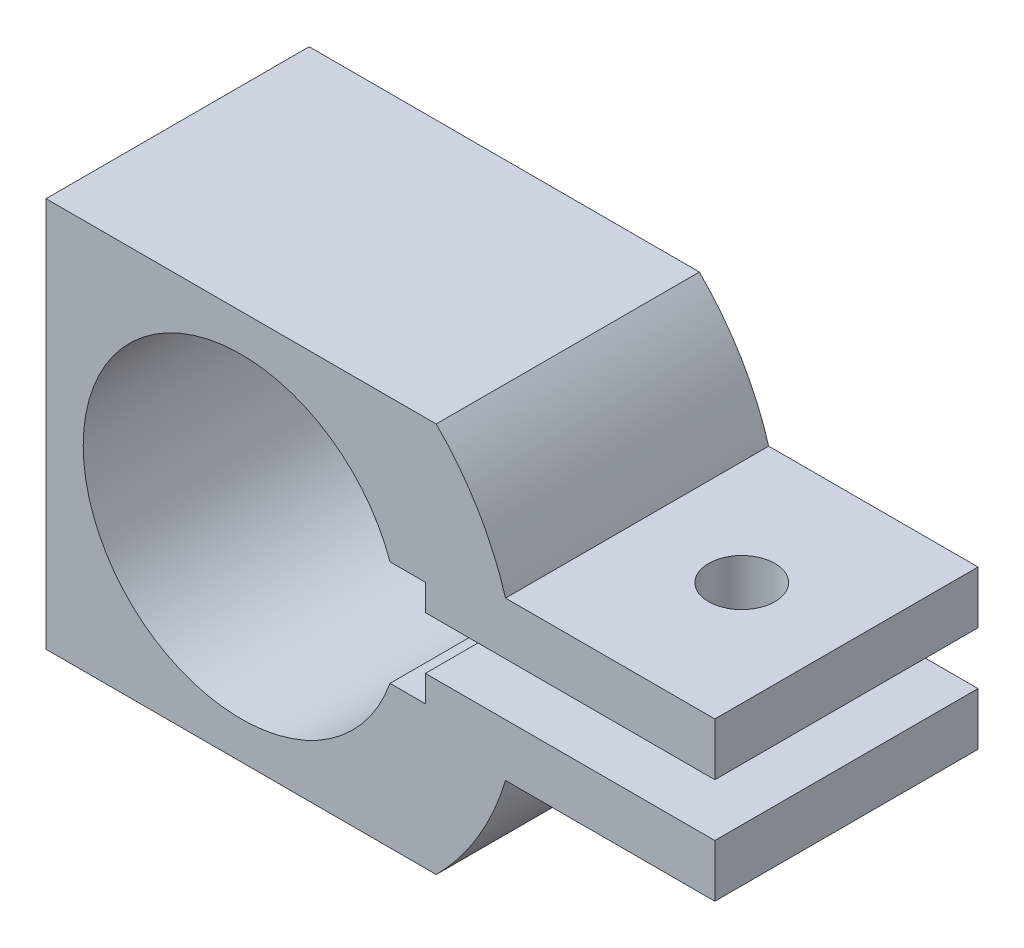
ISO-10303-21;
HEADER;
FILE_DESCRIPTION(('STEP AP214'),'2;1');
FILE_NAME('part.step','',(''),(''),'','','');
FILE_SCHEMA(('AUTOMOTIVE_DESIGN { 1 0 10303 214 1 1 1 1 }'));
ENDSEC;
DATA;
#1=APPLICATION_CONTEXT('core data for automotive mechanical design processes');
#2=APPLICATION_PROTOCOL_DEFINITION('international standard','automotive_design',2000,#1);
#3=PRODUCT_CONTEXT('',#1,'mechanical');
#4=PRODUCT('Part','Part','',(#3));
#5=PRODUCT_RELATED_PRODUCT_CATEGORY('part','',(#4));
#6=PRODUCT_DEFINITION_FORMATION('','',#4);
#7=PRODUCT_DEFINITION_CONTEXT('part definition',#1,'design');
#8=PRODUCT_DEFINITION('design','',#6,#7);
#9=PRODUCT_DEFINITION_SHAPE('','',#8);
#10=(LENGTH_UNIT() NAMED_UNIT(*) SI_UNIT(.MILLI.,.METRE.));
#11=(NAMED_UNIT(*) PLANE_ANGLE_UNIT() SI_UNIT($,.RADIAN.));
#12=(NAMED_UNIT(*) SI_UNIT($,.STERADIAN.) SOLID_ANGLE_UNIT());
#13=UNCERTAINTY_MEASURE_WITH_UNIT(LENGTH_MEASURE(1.E-05),#10,'distance_accuracy_value','');
#14=(GEOMETRIC_REPRESENTATION_CONTEXT(3) GLOBAL_UNCERTAINTY_ASSIGNED_CONTEXT((#13)) GLOBAL_UNIT_ASSIGNED_CONTEXT((#10,
#11,#12)) REPRESENTATION_CONTEXT('',''));
#15=CARTESIAN_POINT('',(0.,0.,0.));
#16=DIRECTION('',(0.,0.,1.));
#17=DIRECTION('',(1.,0.,0.));
#18=AXIS2_PLACEMENT_3D('',#15,#16,#17);
#19=CARTESIAN_POINT('',(7.,0.,97.0000000000001));
#20=DIRECTION('',(1.,0.,0.));
#21=DIRECTION('',(0.,0.,-1.));
#22=AXIS2_PLACEMENT_3D('',#19,#20,#21);
#23=PLANE('',#22);
#24=DIRECTION('',(0.,0.,-1.));
#25=VECTOR('',#24,1.);
#26=CARTESIAN_POINT('',(7.,1.,95.0000000000001));
#27=LINE('',#26,#25);
#28=CARTESIAN_POINT('',(7.,1.,10.));
#29=VERTEX_POINT('',#28);
#30=CARTESIAN_POINT('',(7.,1.,0.));
#31=VERTEX_POINT('',#30);
#32=EDGE_CURVE('E166',#29,#31,#27,.T.);
#33=ORIENTED_EDGE('',*,*,#32,.F.);
#34=DIRECTION('',(0.,1.,0.));
#35=VECTOR('',#34,1.);
#36=CARTESIAN_POINT('',(7.,0.,10.));
#37=LINE('',#36,#35);
#38=CARTESIAN_POINT('',(7.,2.,10.));
#39=VERTEX_POINT('',#38);
#40=EDGE_CURVE('E202',#29,#39,#37,.T.);
#41=ORIENTED_EDGE('',*,*,#40,.T.);
#42=DIRECTION('',(0.,0.,-1.));
#43=VECTOR('',#42,1.);
#44=CARTESIAN_POINT('',(7.,2.,97.0000000000001));
#45=LINE('',#44,#43);
#46=CARTESIAN_POINT('',(7.,2.,0.));
#47=VERTEX_POINT('',#46);
#48=EDGE_CURVE('E176',#39,#47,#45,.T.);
#49=ORIENTED_EDGE('',*,*,#48,.T.);
#50=DIRECTION('',(0.,-1.,0.));
#51=VECTOR('',#50,1.);
#52=CARTESIAN_POINT('',(7.,0.,0.));
#53=LINE('',#52,#51);
#54=EDGE_CURVE('E157',#47,#31,#53,.T.);
#55=ORIENTED_EDGE('',*,*,#54,.T.);
#56=EDGE_LOOP('',(#33,#41,#49,#55));
#57=FACE_BOUND('',#56,.T.);
#58=ADVANCED_FACE('F39',(#57),#23,.F.);
#59=CARTESIAN_POINT('',(18.,0.,285.));
#60=DIRECTION('',(1.,0.,0.));
#61=DIRECTION('',(0.,0.,-1.));
#62=AXIS2_PLACEMENT_3D('',#59,#60,#61);
#63=PLANE('',#62);
#64=DIRECTION('',(0.,1.,0.));
#65=VECTOR('',#64,1.);
#66=CARTESIAN_POINT('',(18.,0.,10.));
#67=LINE('',#66,#65);
#68=CARTESIAN_POINT('',(18.,1.,10.0000000000001));
#69=VERTEX_POINT('',#68);
#70=CARTESIAN_POINT('',(18.,3.,10.0000000000001));
#71=VERTEX_POINT('',#70);
#72=EDGE_CURVE('E261',#69,#71,#67,.T.);
#73=ORIENTED_EDGE('',*,*,#72,.F.);
#74=DIRECTION('',(0.,0.,-1.));
#75=VECTOR('',#74,1.);
#76=CARTESIAN_POINT('',(18.,1.,285.));
#77=LINE('',#76,#75);
#78=CARTESIAN_POINT('',(18.,1.,0.));
#79=VERTEX_POINT('',#78);
#80=EDGE_CURVE('E49',#69,#79,#77,.T.);
#81=ORIENTED_EDGE('',*,*,#80,.T.);
#82=DIRECTION('',(0.,-1.,0.));
#83=VECTOR('',#82,1.);
#84=CARTESIAN_POINT('',(18.,0.,0.));
#85=LINE('',#84,#83);
#86=CARTESIAN_POINT('',(18.,3.,0.));
#87=VERTEX_POINT('',#86);
#88=EDGE_CURVE('E160',#87,#79,#85,.T.);
#89=ORIENTED_EDGE('',*,*,#88,.F.);
#90=DIRECTION('',(0.,0.,-1.));
#91=VECTOR('',#90,1.);
#92=CARTESIAN_POINT('',(18.,3.,285.));
#93=LINE('',#92,#91);
#94=EDGE_CURVE('E297',#71,#87,#93,.T.);
#95=ORIENTED_EDGE('',*,*,#94,.F.);
#96=EDGE_LOOP('',(#73,#81,#89,#95));
#97=FACE_BOUND('',#96,.T.);
#98=ADVANCED_FACE('F259',(#97),#63,.T.);
#99=CARTESIAN_POINT('',(0.,0.,10.));
#100=DIRECTION('',(0.,0.,1.));
#101=DIRECTION('',(1.,0.,0.));
#102=AXIS2_PLACEMENT_3D('',#99,#100,#101);
#103=PLANE('',#102);
#104=DIRECTION('',(1.,0.,0.));
#105=VECTOR('',#104,1.);
#106=CARTESIAN_POINT('',(0.,-1.,10.));
#107=LINE('',#106,#105);
#108=CARTESIAN_POINT('',(7.,-1.,10.));
#109=VERTEX_POINT('',#108);
#110=CARTESIAN_POINT('',(18.,-1.,10.0000000000001));
#111=VERTEX_POINT('',#110);
#112=EDGE_CURVE('E268',#109,#111,#107,.T.);
#113=ORIENTED_EDGE('',*,*,#112,.F.);
#114=CARTESIAN_POINT('',(7.,-2.,10.));
#115=VERTEX_POINT('',#114);
#116=EDGE_CURVE('E203',#115,#109,#37,.T.);
#117=ORIENTED_EDGE('',*,*,#116,.F.);
#118=DIRECTION('',(-1.,0.,0.));
#119=VECTOR('',#118,1.);
#120=CARTESIAN_POINT('',(0.,-1.99999999999999,10.));
#121=LINE('',#120,#119);
#122=CARTESIAN_POINT('',(5.65685424949238,-2.,10.));
#123=VERTEX_POINT('',#122);
#124=EDGE_CURVE('E198',#115,#123,#121,.T.);
#125=ORIENTED_EDGE('',*,*,#124,.T.);
#126=CARTESIAN_POINT('',(0.,0.,10.));
#127=DIRECTION('',(0.,0.,1.));
#128=DIRECTION('',(1.,0.,0.));
#129=AXIS2_PLACEMENT_3D('',#126,#127,#128);
#130=CIRCLE('',#129,6.);
#131=CARTESIAN_POINT('',(5.65685424949238,2.,10.));
#132=VERTEX_POINT('',#131);
#133=EDGE_CURVE('E211',#123,#132,#130,.F.);
#134=ORIENTED_EDGE('',*,*,#133,.T.);
#135=DIRECTION('',(-1.,0.,0.));
#136=VECTOR('',#135,1.);
#137=CARTESIAN_POINT('',(0.,2.,10.));
#138=LINE('',#137,#136);
#139=EDGE_CURVE('E195',#39,#132,#138,.T.);
#140=ORIENTED_EDGE('',*,*,#139,.F.);
#141=ORIENTED_EDGE('',*,*,#40,.F.);
#142=DIRECTION('',(1.,0.,0.));
#143=VECTOR('',#142,1.);
#144=CARTESIAN_POINT('',(0.,1.,10.));
#145=LINE('',#144,#143);
#146=EDGE_CURVE('E162',#29,#69,#145,.T.);
#147=ORIENTED_EDGE('',*,*,#146,.T.);
#148=ORIENTED_EDGE('',*,*,#72,.T.);
#149=DIRECTION('',(-1.,0.,0.));
#150=VECTOR('',#149,1.);
#151=CARTESIAN_POINT('',(0.,3.,10.));
#152=LINE('',#151,#150);
#153=CARTESIAN_POINT('',(10.0469460781349,3.,10.0000000000001));
#154=VERTEX_POINT('',#153);
#155=EDGE_CURVE('E315',#71,#154,#152,.T.);
#156=ORIENTED_EDGE('',*,*,#155,.T.);
#157=CARTESIAN_POINT('',(0.,0.,10.));
#158=DIRECTION('',(0.,0.,1.));
#159=DIRECTION('',(1.,0.,0.));
#160=AXIS2_PLACEMENT_3D('',#157,#158,#159);
#161=CIRCLE('',#160,10.4852813742384);
#162=CARTESIAN_POINT('',(7.41421356237296,7.41421356237295,10.0000000000001));
#163=VERTEX_POINT('',#162);
#164=EDGE_CURVE('E303',#163,#154,#161,.F.);
#165=ORIENTED_EDGE('',*,*,#164,.F.);
#166=DIRECTION('',(1.,0.,0.));
#167=VECTOR('',#166,1.);
#168=CARTESIAN_POINT('',(-7.41421356237295,7.41421356237295,10.));
#169=LINE('',#168,#167);
#170=CARTESIAN_POINT('',(-7.41421356237295,7.41421356237295,10.));
#171=VERTEX_POINT('',#170);
#172=EDGE_CURVE('E225',#171,#163,#169,.T.);
#173=ORIENTED_EDGE('',*,*,#172,.F.);
#174=DIRECTION('',(0.,-1.,0.));
#175=VECTOR('',#174,1.);
#176=CARTESIAN_POINT('',(-7.41421356237295,7.41421356237295,10.));
#177=LINE('',#176,#175);
#178=CARTESIAN_POINT('',(-7.41421356237295,-7.41421356237295,10.));
#179=VERTEX_POINT('',#178);
#180=EDGE_CURVE('E216',#171,#179,#177,.T.);
#181=ORIENTED_EDGE('',*,*,#180,.T.);
#182=DIRECTION('',(1.,0.,0.));
#183=VECTOR('',#182,1.);
#184=CARTESIAN_POINT('',(-7.41421356237295,-7.41421356237295,10.));
#185=LINE('',#184,#183);
#186=CARTESIAN_POINT('',(7.41421356237295,-7.41421356237295,10.0000000000001));
#187=VERTEX_POINT('',#186);
#188=EDGE_CURVE('E220',#179,#187,#185,.T.);
#189=ORIENTED_EDGE('',*,*,#188,.T.);
#190=CARTESIAN_POINT('',(0.,0.,10.));
#191=DIRECTION('',(0.,0.,1.));
#192=DIRECTION('',(1.,0.,0.));
#193=AXIS2_PLACEMENT_3D('',#190,#191,#192);
#194=CIRCLE('',#193,10.4852813742384);
#195=CARTESIAN_POINT('',(10.0469460781349,-3.,10.0000000000001));
#196=VERTEX_POINT('',#195);
#197=EDGE_CURVE('E306',#196,#187,#194,.F.);
#198=ORIENTED_EDGE('',*,*,#197,.F.);
#199=DIRECTION('',(-1.,0.,0.));
#200=VECTOR('',#199,1.);
#201=CARTESIAN_POINT('',(0.,-3.,10.));
#202=LINE('',#201,#200);
#203=CARTESIAN_POINT('',(18.,-3.,10.0000000000001));
#204=VERTEX_POINT('',#203);
#205=EDGE_CURVE('E309',#204,#196,#202,.T.);
#206=ORIENTED_EDGE('',*,*,#205,.F.);
#207=EDGE_CURVE('E312',#204,#111,#67,.T.);
#208=ORIENTED_EDGE('',*,*,#207,.T.);
#209=EDGE_LOOP('',(#113,#117,#125,#134,#140,#141,#147,#148,#156,#165,#173,#181,#189,#198,#206,#208));
#210=FACE_BOUND('',#209,.T.);
#211=ADVANCED_FACE('F263',(#210),#103,.T.);
#212=CARTESIAN_POINT('',(0.,0.,0.));
#213=DIRECTION('',(0.,0.,1.));
#214=DIRECTION('',(1.,0.,0.));
#215=AXIS2_PLACEMENT_3D('',#212,#213,#214);
#216=PLANE('',#215);
#217=CARTESIAN_POINT('',(7.,-1.,0.));
#218=VERTEX_POINT('',#217);
#219=CARTESIAN_POINT('',(7.,-2.,0.));
#220=VERTEX_POINT('',#219);
#221=EDGE_CURVE('E180',#218,#220,#53,.T.);
#222=ORIENTED_EDGE('',*,*,#221,.F.);
#223=DIRECTION('',(-1.,0.,0.));
#224=VECTOR('',#223,1.);
#225=CARTESIAN_POINT('',(0.,-1.,0.));
#226=LINE('',#225,#224);
#227=CARTESIAN_POINT('',(18.,-1.,0.));
#228=VERTEX_POINT('',#227);
#229=EDGE_CURVE('E163',#228,#218,#226,.T.);
#230=ORIENTED_EDGE('',*,*,#229,.F.);
#231=CARTESIAN_POINT('',(18.,-3.,0.));
#232=VERTEX_POINT('',#231);
#233=EDGE_CURVE('E280',#228,#232,#85,.T.);
#234=ORIENTED_EDGE('',*,*,#233,.T.);
#235=DIRECTION('',(1.,0.,0.));
#236=VECTOR('',#235,1.);
#237=CARTESIAN_POINT('',(0.,-3.,0.));
#238=LINE('',#237,#236);
#239=CARTESIAN_POINT('',(10.0469460781349,-3.,0.));
#240=VERTEX_POINT('',#239);
#241=EDGE_CURVE('E283',#240,#232,#238,.T.);
#242=ORIENTED_EDGE('',*,*,#241,.F.);
#243=CARTESIAN_POINT('',(0.,0.,0.));
#244=DIRECTION('',(0.,0.,1.));
#245=DIRECTION('',(1.,0.,0.));
#246=AXIS2_PLACEMENT_3D('',#243,#244,#245);
#247=CIRCLE('',#246,10.4852813742384);
#248=CARTESIAN_POINT('',(7.41421356237295,-7.41421356237295,0.));
#249=VERTEX_POINT('',#248);
#250=EDGE_CURVE('E277',#249,#240,#247,.T.);
#251=ORIENTED_EDGE('',*,*,#250,.F.);
#252=DIRECTION('',(1.,0.,0.));
#253=VECTOR('',#252,1.);
#254=CARTESIAN_POINT('',(-7.41421356237295,-7.41421356237295,0.));
#255=LINE('',#254,#253);
#256=CARTESIAN_POINT('',(-7.41421356237295,-7.41421356237295,0.));
#257=VERTEX_POINT('',#256);
#258=EDGE_CURVE('E233',#257,#249,#255,.T.);
#259=ORIENTED_EDGE('',*,*,#258,.F.);
#260=DIRECTION('',(0.,-1.,0.));
#261=VECTOR('',#260,1.);
#262=CARTESIAN_POINT('',(-7.41421356237295,7.41421356237295,0.));
#263=LINE('',#262,#261);
#264=CARTESIAN_POINT('',(-7.41421356237295,7.41421356237295,0.));
#265=VERTEX_POINT('',#264);
#266=EDGE_CURVE('E215',#265,#257,#263,.T.);
#267=ORIENTED_EDGE('',*,*,#266,.F.);
#268=DIRECTION('',(1.,0.,0.));
#269=VECTOR('',#268,1.);
#270=CARTESIAN_POINT('',(-7.41421356237295,7.41421356237295,0.));
#271=LINE('',#270,#269);
#272=CARTESIAN_POINT('',(7.41421356237295,7.41421356237295,0.));
#273=VERTEX_POINT('',#272);
#274=EDGE_CURVE('E221',#265,#273,#271,.T.);
#275=ORIENTED_EDGE('',*,*,#274,.T.);
#276=CARTESIAN_POINT('',(10.0469460781349,3.,0.));
#277=VERTEX_POINT('',#276);
#278=EDGE_CURVE('E64',#277,#273,#247,.T.);
#279=ORIENTED_EDGE('',*,*,#278,.F.);
#280=DIRECTION('',(1.,0.,0.));
#281=VECTOR('',#280,1.);
#282=CARTESIAN_POINT('',(0.,3.,0.));
#283=LINE('',#282,#281);
#284=EDGE_CURVE('E276',#277,#87,#283,.T.);
#285=ORIENTED_EDGE('',*,*,#284,.T.);
#286=ORIENTED_EDGE('',*,*,#88,.T.);
#287=DIRECTION('',(-1.,0.,0.));
#288=VECTOR('',#287,1.);
#289=CARTESIAN_POINT('',(0.,1.,0.));
#290=LINE('',#289,#288);
#291=EDGE_CURVE('E56',#79,#31,#290,.T.);
#292=ORIENTED_EDGE('',*,*,#291,.T.);
#293=ORIENTED_EDGE('',*,*,#54,.F.);
#294=DIRECTION('',(1.,0.,0.));
#295=VECTOR('',#294,1.);
#296=CARTESIAN_POINT('',(0.,2.,0.));
#297=LINE('',#296,#295);
#298=CARTESIAN_POINT('',(5.65685424949238,2.,0.));
#299=VERTEX_POINT('',#298);
#300=EDGE_CURVE('E179',#299,#47,#297,.T.);
#301=ORIENTED_EDGE('',*,*,#300,.F.);
#302=CARTESIAN_POINT('',(0.,0.,0.));
#303=DIRECTION('',(0.,0.,1.));
#304=DIRECTION('',(1.,0.,0.));
#305=AXIS2_PLACEMENT_3D('',#302,#303,#304);
#306=CIRCLE('',#305,6.);
#307=CARTESIAN_POINT('',(5.65685424949238,-2.,0.));
#308=VERTEX_POINT('',#307);
#309=EDGE_CURVE('E207',#299,#308,#306,.T.);
#310=ORIENTED_EDGE('',*,*,#309,.T.);
#311=DIRECTION('',(1.,0.,0.));
#312=VECTOR('',#311,1.);
#313=CARTESIAN_POINT('',(0.,-1.99999999999999,0.));
#314=LINE('',#313,#312);
#315=EDGE_CURVE('E185',#308,#220,#314,.T.);
#316=ORIENTED_EDGE('',*,*,#315,.T.);
#317=EDGE_LOOP('',(#222,#230,#234,#242,#251,#259,#267,#275,#279,#285,#286,#292,#293,#301,#310,#316));
#318=FACE_BOUND('',#317,.T.);
#319=ADVANCED_FACE('F154',(#318),#216,.F.);
#320=CARTESIAN_POINT('',(0.,0.,15.));
#321=DIRECTION('',(0.,0.,-1.));
#322=DIRECTION('',(-1.,0.,0.));
#323=AXIS2_PLACEMENT_3D('',#320,#321,#322);
#324=CYLINDRICAL_SURFACE('',#323,6.);
#325=ORIENTED_EDGE('',*,*,#133,.F.);
#326=DIRECTION('',(0.,0.,-1.));
#327=VECTOR('',#326,1.);
#328=CARTESIAN_POINT('',(5.65685424949238,-2.,15.));
#329=LINE('',#328,#327);
#330=EDGE_CURVE('E249',#123,#308,#329,.T.);
#331=ORIENTED_EDGE('',*,*,#330,.T.);
#332=ORIENTED_EDGE('',*,*,#309,.F.);
#333=DIRECTION('',(0.,0.,-1.));
#334=VECTOR('',#333,1.);
#335=CARTESIAN_POINT('',(5.65685424949238,2.,15.));
#336=LINE('',#335,#334);
#337=EDGE_CURVE('E246',#132,#299,#336,.T.);
#338=ORIENTED_EDGE('',*,*,#337,.F.);
#339=EDGE_LOOP('',(#325,#331,#332,#338));
#340=FACE_BOUND('',#339,.T.);
#341=ADVANCED_FACE('F327',(#340),#324,.F.);
#342=CARTESIAN_POINT('',(-7.41421356237295,7.41421356237295,10.));
#343=DIRECTION('',(1.,0.,0.));
#344=DIRECTION('',(0.,0.,-1.));
#345=AXIS2_PLACEMENT_3D('',#342,#343,#344);
#346=PLANE('',#345);
#347=ORIENTED_EDGE('',*,*,#266,.T.);
#348=DIRECTION('',(0.,0.,-1.));
#349=VECTOR('',#348,1.);
#350=CARTESIAN_POINT('',(-7.41421356237295,-7.41421356237295,10.));
#351=LINE('',#350,#349);
#352=EDGE_CURVE('E242',#179,#257,#351,.T.);
#353=ORIENTED_EDGE('',*,*,#352,.F.);
#354=ORIENTED_EDGE('',*,*,#180,.F.);
#355=DIRECTION('',(0.,0.,-1.));
#356=VECTOR('',#355,1.);
#357=CARTESIAN_POINT('',(-7.41421356237295,7.41421356237295,10.));
#358=LINE('',#357,#356);
#359=EDGE_CURVE('E229',#171,#265,#358,.T.);
#360=ORIENTED_EDGE('',*,*,#359,.T.);
#361=EDGE_LOOP('',(#347,#353,#354,#360));
#362=FACE_BOUND('',#361,.T.);
#363=ADVANCED_FACE('F41',(#362),#346,.F.);
#364=CARTESIAN_POINT('',(-7.41421356237295,-7.41421356237295,10.));
#365=DIRECTION('',(0.,1.,0.));
#366=DIRECTION('',(-1.,0.,0.));
#367=AXIS2_PLACEMENT_3D('',#364,#365,#366);
#368=PLANE('',#367);
#369=ORIENTED_EDGE('',*,*,#258,.T.);
#370=DIRECTION('',(0.,0.,-1.));
#371=VECTOR('',#370,1.);
#372=CARTESIAN_POINT('',(7.41421356237295,-7.41421356237295,285.));
#373=LINE('',#372,#371);
#374=EDGE_CURVE('E287',#187,#249,#373,.T.);
#375=ORIENTED_EDGE('',*,*,#374,.F.);
#376=ORIENTED_EDGE('',*,*,#188,.F.);
#377=ORIENTED_EDGE('',*,*,#352,.T.);
#378=EDGE_LOOP('',(#369,#375,#376,#377));
#379=FACE_BOUND('',#378,.T.);
#380=ADVANCED_FACE('F370',(#379),#368,.F.);
#381=CARTESIAN_POINT('',(-7.41421356237295,7.41421356237295,10.));
#382=DIRECTION('',(0.,1.,0.));
#383=DIRECTION('',(0.,0.,1.));
#384=AXIS2_PLACEMENT_3D('',#381,#382,#383);
#385=PLANE('',#384);
#386=DIRECTION('',(0.,0.,-1.));
#387=VECTOR('',#386,1.);
#388=CARTESIAN_POINT('',(7.41421356237296,7.41421356237295,285.));
#389=LINE('',#388,#387);
#390=EDGE_CURVE('E253',#273,#163,#389,.F.);
#391=ORIENTED_EDGE('',*,*,#390,.F.);
#392=ORIENTED_EDGE('',*,*,#274,.F.);
#393=ORIENTED_EDGE('',*,*,#359,.F.);
#394=ORIENTED_EDGE('',*,*,#172,.T.);
#395=EDGE_LOOP('',(#391,#392,#393,#394));
#396=FACE_BOUND('',#395,.T.);
#397=ADVANCED_FACE('F376',(#396),#385,.T.);
#398=CARTESIAN_POINT('',(0.,-1.99999999999999,97.0000000000001));
#399=DIRECTION('',(0.,1.,0.));
#400=DIRECTION('',(-1.,0.,0.));
#401=AXIS2_PLACEMENT_3D('',#398,#399,#400);
#402=PLANE('',#401);
#403=DIRECTION('',(0.,0.,-1.));
#404=VECTOR('',#403,1.);
#405=CARTESIAN_POINT('',(7.,-2.,97.0000000000001));
#406=LINE('',#405,#404);
#407=EDGE_CURVE('E191',#115,#220,#406,.T.);
#408=ORIENTED_EDGE('',*,*,#407,.T.);
#409=ORIENTED_EDGE('',*,*,#315,.F.);
#410=ORIENTED_EDGE('',*,*,#330,.F.);
#411=ORIENTED_EDGE('',*,*,#124,.F.);
#412=EDGE_LOOP('',(#408,#409,#410,#411));
#413=FACE_BOUND('',#412,.T.);
#414=ADVANCED_FACE('F323',(#413),#402,.T.);
#415=ORIENTED_EDGE('',*,*,#116,.T.);
#416=DIRECTION('',(0.,0.,-1.));
#417=VECTOR('',#416,1.);
#418=CARTESIAN_POINT('',(7.,-1.,95.0000000000001));
#419=LINE('',#418,#417);
#420=EDGE_CURVE('E173',#109,#218,#419,.T.);
#421=ORIENTED_EDGE('',*,*,#420,.T.);
#422=ORIENTED_EDGE('',*,*,#221,.T.);
#423=ORIENTED_EDGE('',*,*,#407,.F.);
#424=EDGE_LOOP('',(#415,#421,#422,#423));
#425=FACE_BOUND('',#424,.T.);
#426=ADVANCED_FACE('F331',(#425),#23,.F.);
#427=CARTESIAN_POINT('',(0.,2.,97.0000000000001));
#428=DIRECTION('',(0.,1.,0.));
#429=DIRECTION('',(-1.,0.,0.));
#430=AXIS2_PLACEMENT_3D('',#427,#428,#429);
#431=PLANE('',#430);
#432=ORIENTED_EDGE('',*,*,#139,.T.);
#433=ORIENTED_EDGE('',*,*,#337,.T.);
#434=ORIENTED_EDGE('',*,*,#300,.T.);
#435=ORIENTED_EDGE('',*,*,#48,.F.);
#436=EDGE_LOOP('',(#432,#433,#434,#435));
#437=FACE_BOUND('',#436,.T.);
#438=ADVANCED_FACE('F396',(#437),#431,.F.);
#439=CARTESIAN_POINT('',(0.,0.,285.));
#440=DIRECTION('',(0.,0.,-1.));
#441=DIRECTION('',(-1.,0.,0.));
#442=AXIS2_PLACEMENT_3D('',#439,#440,#441);
#443=CYLINDRICAL_SURFACE('',#442,10.4852813742384);
#444=ORIENTED_EDGE('',*,*,#164,.T.);
#445=DIRECTION('',(0.,0.,-1.));
#446=VECTOR('',#445,1.);
#447=CARTESIAN_POINT('',(10.0469460781349,3.,285.));
#448=LINE('',#447,#446);
#449=EDGE_CURVE('E300',#154,#277,#448,.T.);
#450=ORIENTED_EDGE('',*,*,#449,.T.);
#451=ORIENTED_EDGE('',*,*,#278,.T.);
#452=ORIENTED_EDGE('',*,*,#390,.T.);
#453=EDGE_LOOP('',(#444,#450,#451,#452));
#454=FACE_BOUND('',#453,.T.);
#455=ADVANCED_FACE('F379',(#454),#443,.T.);
#456=CARTESIAN_POINT('',(0.,3.,285.));
#457=DIRECTION('',(0.,1.,0.));
#458=DIRECTION('',(0.,0.,1.));
#459=AXIS2_PLACEMENT_3D('',#456,#457,#458);
#460=PLANE('',#459);
#461=CARTESIAN_POINT('',(14.0234730390674,3.,5.00000000000006));
#462=DIRECTION('',(0.,1.,0.));
#463=DIRECTION('',(0.,0.,1.));
#464=AXIS2_PLACEMENT_3D('',#461,#462,#463);
#465=CIRCLE('',#464,1.26);
#466=CARTESIAN_POINT('',(14.0234730390674,3.,6.26000000000006));
#467=VERTEX_POINT('',#466);
#468=EDGE_CURVE('E345',#467,#467,#465,.T.);
#469=ORIENTED_EDGE('',*,*,#468,.F.);
#470=EDGE_LOOP('',(#469));
#471=FACE_BOUND('',#470,.T.);
#472=ORIENTED_EDGE('',*,*,#94,.T.);
#473=ORIENTED_EDGE('',*,*,#284,.F.);
#474=ORIENTED_EDGE('',*,*,#449,.F.);
#475=ORIENTED_EDGE('',*,*,#155,.F.);
#476=EDGE_LOOP('',(#472,#473,#474,#475));
#477=FACE_BOUND('',#476,.T.);
#478=ADVANCED_FACE('F456',(#471,#477),#460,.T.);
#479=DIRECTION('',(0.,0.,-1.));
#480=VECTOR('',#479,1.);
#481=CARTESIAN_POINT('',(18.,-1.,285.));
#482=LINE('',#481,#480);
#483=EDGE_CURVE('E11',#111,#228,#482,.T.);
#484=ORIENTED_EDGE('',*,*,#483,.F.);
#485=ORIENTED_EDGE('',*,*,#207,.F.);
#486=DIRECTION('',(0.,0.,-1.));
#487=VECTOR('',#486,1.);
#488=CARTESIAN_POINT('',(18.,-3.,285.));
#489=LINE('',#488,#487);
#490=EDGE_CURVE('E293',#204,#232,#489,.T.);
#491=ORIENTED_EDGE('',*,*,#490,.T.);
#492=ORIENTED_EDGE('',*,*,#233,.F.);
#493=EDGE_LOOP('',(#484,#485,#491,#492));
#494=FACE_BOUND('',#493,.T.);
#495=ADVANCED_FACE('F354',(#494),#63,.T.);
#496=CARTESIAN_POINT('',(0.,-3.,285.));
#497=DIRECTION('',(0.,1.,0.));
#498=DIRECTION('',(-1.,0.,0.));
#499=AXIS2_PLACEMENT_3D('',#496,#497,#498);
#500=PLANE('',#499);
#501=CARTESIAN_POINT('',(14.0234730390674,-3.,5.00000000000006));
#502=DIRECTION('',(0.,-1.,0.));
#503=DIRECTION('',(1.,0.,0.));
#504=AXIS2_PLACEMENT_3D('',#501,#502,#503);
#505=CIRCLE('',#504,1.26);
#506=CARTESIAN_POINT('',(15.2834730390674,-3.,5.00000000000006));
#507=VERTEX_POINT('',#506);
#508=EDGE_CURVE('E172',#507,#507,#505,.T.);
#509=ORIENTED_EDGE('',*,*,#508,.F.);
#510=EDGE_LOOP('',(#509));
#511=FACE_BOUND('',#510,.T.);
#512=ORIENTED_EDGE('',*,*,#205,.T.);
#513=DIRECTION('',(0.,0.,-1.));
#514=VECTOR('',#513,1.);
#515=CARTESIAN_POINT('',(10.0469460781349,-3.,285.));
#516=LINE('',#515,#514);
#517=EDGE_CURVE('E290',#196,#240,#516,.T.);
#518=ORIENTED_EDGE('',*,*,#517,.T.);
#519=ORIENTED_EDGE('',*,*,#241,.T.);
#520=ORIENTED_EDGE('',*,*,#490,.F.);
#521=EDGE_LOOP('',(#512,#518,#519,#520));
#522=FACE_BOUND('',#521,.T.);
#523=ADVANCED_FACE('F367',(#511,#522),#500,.F.);
#524=ORIENTED_EDGE('',*,*,#197,.T.);
#525=ORIENTED_EDGE('',*,*,#374,.T.);
#526=ORIENTED_EDGE('',*,*,#250,.T.);
#527=ORIENTED_EDGE('',*,*,#517,.F.);
#528=EDGE_LOOP('',(#524,#525,#526,#527));
#529=FACE_BOUND('',#528,.T.);
#530=ADVANCED_FACE('F363',(#529),#443,.T.);
#531=CARTESIAN_POINT('',(0.,-1.,202.));
#532=DIRECTION('',(0.,-1.,0.));
#533=DIRECTION('',(0.,0.,-1.));
#534=AXIS2_PLACEMENT_3D('',#531,#532,#533);
#535=PLANE('',#534);
#536=CARTESIAN_POINT('',(14.0234730390674,-1.,5.00000000000006));
#537=DIRECTION('',(0.,-1.,0.));
#538=DIRECTION('',(0.,0.,-1.));
#539=AXIS2_PLACEMENT_3D('',#536,#537,#538);
#540=CIRCLE('',#539,1.26);
#541=CARTESIAN_POINT('',(14.0234730390674,-1.,3.74000000000006));
#542=VERTEX_POINT('',#541);
#543=EDGE_CURVE('E341',#542,#542,#540,.T.);
#544=ORIENTED_EDGE('',*,*,#543,.T.);
#545=EDGE_LOOP('',(#544));
#546=FACE_BOUND('',#545,.T.);
#547=ORIENTED_EDGE('',*,*,#112,.T.);
#548=ORIENTED_EDGE('',*,*,#483,.T.);
#549=ORIENTED_EDGE('',*,*,#229,.T.);
#550=ORIENTED_EDGE('',*,*,#420,.F.);
#551=EDGE_LOOP('',(#547,#548,#549,#550));
#552=FACE_BOUND('',#551,.T.);
#553=ADVANCED_FACE('F349',(#546,#552),#535,.F.);
#554=CARTESIAN_POINT('',(0.,1.,202.));
#555=DIRECTION('',(0.,-1.,0.));
#556=DIRECTION('',(0.,0.,-1.));
#557=AXIS2_PLACEMENT_3D('',#554,#555,#556);
#558=PLANE('',#557);
#559=CARTESIAN_POINT('',(14.0234730390674,1.,5.00000000000006));
#560=DIRECTION('',(0.,-1.,0.));
#561=DIRECTION('',(0.,0.,-1.));
#562=AXIS2_PLACEMENT_3D('',#559,#560,#561);
#563=CIRCLE('',#562,1.26);
#564=CARTESIAN_POINT('',(14.0234730390674,1.,3.74000000000006));
#565=VERTEX_POINT('',#564);
#566=EDGE_CURVE('E43',#565,#565,#563,.T.);
#567=ORIENTED_EDGE('',*,*,#566,.F.);
#568=EDGE_LOOP('',(#567));
#569=FACE_BOUND('',#568,.T.);
#570=ORIENTED_EDGE('',*,*,#146,.F.);
#571=ORIENTED_EDGE('',*,*,#32,.T.);
#572=ORIENTED_EDGE('',*,*,#291,.F.);
#573=ORIENTED_EDGE('',*,*,#80,.F.);
#574=EDGE_LOOP('',(#570,#571,#572,#573));
#575=FACE_BOUND('',#574,.T.);
#576=ADVANCED_FACE('F167',(#569,#575),#558,.T.);
#577=CARTESIAN_POINT('',(14.0234730390675,199.,5.00000000000006));
#578=DIRECTION('',(0.,-1.,0.));
#579=DIRECTION('',(1.,0.,0.));
#580=AXIS2_PLACEMENT_3D('',#577,#578,#579);
#581=CYLINDRICAL_SURFACE('',#580,1.26);
#582=ORIENTED_EDGE('',*,*,#468,.T.);
#583=EDGE_LOOP('',(#582));
#584=FACE_BOUND('',#583,.T.);
#585=ORIENTED_EDGE('',*,*,#566,.T.);
#586=EDGE_LOOP('',(#585));
#587=FACE_BOUND('',#586,.T.);
#588=ADVANCED_FACE('F505',(#584,#587),#581,.F.);
#589=ORIENTED_EDGE('',*,*,#508,.T.);
#590=EDGE_LOOP('',(#589));
#591=FACE_BOUND('',#590,.T.);
#592=ORIENTED_EDGE('',*,*,#543,.F.);
#593=EDGE_LOOP('',(#592));
#594=FACE_BOUND('',#593,.T.);
#595=ADVANCED_FACE('F510',(#591,#594),#581,.F.);
#596=CLOSED_SHELL('',(#58,#98,#211,#319,#341,#363,#380,#397,#414,#426,#438,#455,#478,#495,#523,
#530,#553,#576,#588,#595));
#597=MANIFOLD_SOLID_BREP('B2',#596);
#598=ADVANCED_BREP_SHAPE_REPRESENTATION('',(#18,#597),#14);
#599=SHAPE_DEFINITION_REPRESENTATION(#9,#598);
ENDSEC;
END-ISO-10303-21;
